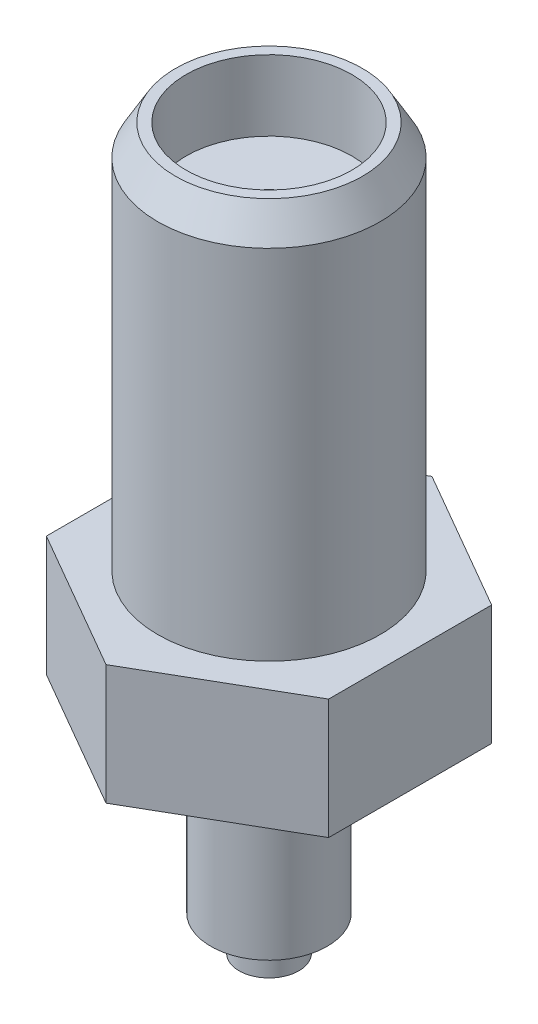
ISO-10303-21;
HEADER;
FILE_DESCRIPTION(('STEP AP214'),'2;1');
FILE_NAME('part.step','',(''),(''),'','','');
FILE_SCHEMA(('AUTOMOTIVE_DESIGN { 1 0 10303 214 1 1 1 1 }'));
ENDSEC;
DATA;
#1=APPLICATION_CONTEXT('core data for automotive mechanical design processes');
#2=APPLICATION_PROTOCOL_DEFINITION('international standard','automotive_design',2000,#1);
#3=PRODUCT_CONTEXT('',#1,'mechanical');
#4=PRODUCT('Part','Part','',(#3));
#5=PRODUCT_RELATED_PRODUCT_CATEGORY('part','',(#4));
#6=PRODUCT_DEFINITION_FORMATION('','',#4);
#7=PRODUCT_DEFINITION_CONTEXT('part definition',#1,'design');
#8=PRODUCT_DEFINITION('design','',#6,#7);
#9=PRODUCT_DEFINITION_SHAPE('','',#8);
#10=(LENGTH_UNIT() NAMED_UNIT(*) SI_UNIT(.MILLI.,.METRE.));
#11=(NAMED_UNIT(*) PLANE_ANGLE_UNIT() SI_UNIT($,.RADIAN.));
#12=(NAMED_UNIT(*) SI_UNIT($,.STERADIAN.) SOLID_ANGLE_UNIT());
#13=UNCERTAINTY_MEASURE_WITH_UNIT(LENGTH_MEASURE(1.E-05),#10,'distance_accuracy_value','');
#14=(GEOMETRIC_REPRESENTATION_CONTEXT(3) GLOBAL_UNCERTAINTY_ASSIGNED_CONTEXT((#13)) GLOBAL_UNIT_ASSIGNED_CONTEXT((#10,
#11,#12)) REPRESENTATION_CONTEXT('',''));
#15=CARTESIAN_POINT('',(0.,0.,0.));
#16=DIRECTION('',(0.,0.,1.));
#17=DIRECTION('',(1.,0.,0.));
#18=AXIS2_PLACEMENT_3D('',#15,#16,#17);
#19=CARTESIAN_POINT('',(5.,0.,0.));
#20=DIRECTION('',(0.,1.,0.));
#21=DIRECTION('',(0.,0.,1.));
#22=AXIS2_PLACEMENT_3D('',#19,#20,#21);
#23=PLANE('',#22);
#24=CARTESIAN_POINT('',(0.,0.,0.));
#25=DIRECTION('',(0.,-1.,0.));
#26=DIRECTION('',(0.,0.,-1.));
#27=AXIS2_PLACEMENT_3D('',#24,#25,#26);
#28=CIRCLE('',#27,3.15000000000001);
#29=CARTESIAN_POINT('',(0.,0.,-3.15000000000001));
#30=VERTEX_POINT('',#29);
#31=EDGE_CURVE('E99',#30,#30,#28,.T.);
#32=ORIENTED_EDGE('',*,*,#31,.T.);
#33=EDGE_LOOP('',(#32));
#34=FACE_BOUND('',#33,.T.);
#35=DIRECTION('',(-0.866025403784439,0.,-0.499999999999999));
#36=VECTOR('',#35,1.);
#37=CARTESIAN_POINT('',(4.,0.,-2.3094010767585));
#38=LINE('',#37,#36);
#39=CARTESIAN_POINT('',(4.,0.,-2.3094010767585));
#40=VERTEX_POINT('',#39);
#41=CARTESIAN_POINT('',(0.,0.,-4.618802153517));
#42=VERTEX_POINT('',#41);
#43=EDGE_CURVE('E128',#40,#42,#38,.T.);
#44=ORIENTED_EDGE('',*,*,#43,.T.);
#45=DIRECTION('',(-0.866025403784439,0.,0.5));
#46=VECTOR('',#45,1.);
#47=CARTESIAN_POINT('',(0.,0.,-4.618802153517));
#48=LINE('',#47,#46);
#49=CARTESIAN_POINT('',(-4.,0.,-2.3094010767585));
#50=VERTEX_POINT('',#49);
#51=EDGE_CURVE('E116',#42,#50,#48,.T.);
#52=ORIENTED_EDGE('',*,*,#51,.T.);
#53=DIRECTION('',(0.,0.,1.));
#54=VECTOR('',#53,1.);
#55=CARTESIAN_POINT('',(-4.,0.,-2.3094010767585));
#56=LINE('',#55,#54);
#57=CARTESIAN_POINT('',(-4.,0.,2.3094010767585));
#58=VERTEX_POINT('',#57);
#59=EDGE_CURVE('E119',#50,#58,#56,.T.);
#60=ORIENTED_EDGE('',*,*,#59,.T.);
#61=DIRECTION('',(0.866025403784439,0.,0.5));
#62=VECTOR('',#61,1.);
#63=CARTESIAN_POINT('',(-4.,0.,2.3094010767585));
#64=LINE('',#63,#62);
#65=CARTESIAN_POINT('',(0.,0.,4.61880215351701));
#66=VERTEX_POINT('',#65);
#67=EDGE_CURVE('E55',#58,#66,#64,.T.);
#68=ORIENTED_EDGE('',*,*,#67,.T.);
#69=DIRECTION('',(0.866025403784439,0.,-0.5));
#70=VECTOR('',#69,1.);
#71=CARTESIAN_POINT('',(0.,0.,4.61880215351701));
#72=LINE('',#71,#70);
#73=CARTESIAN_POINT('',(4.,0.,2.3094010767585));
#74=VERTEX_POINT('',#73);
#75=EDGE_CURVE('E122',#66,#74,#72,.T.);
#76=ORIENTED_EDGE('',*,*,#75,.T.);
#77=DIRECTION('',(0.,0.,-1.));
#78=VECTOR('',#77,1.);
#79=CARTESIAN_POINT('',(4.,0.,2.3094010767585));
#80=LINE('',#79,#78);
#81=EDGE_CURVE('E125',#74,#40,#80,.T.);
#82=ORIENTED_EDGE('',*,*,#81,.T.);
#83=EDGE_LOOP('',(#44,#52,#60,#68,#76,#82));
#84=FACE_BOUND('',#83,.T.);
#85=ADVANCED_FACE('F32',(#34,#84),#23,.T.);
#86=CARTESIAN_POINT('',(2.35,11.,0.));
#87=DIRECTION('',(0.,1.,0.));
#88=DIRECTION('',(0.,0.,1.));
#89=AXIS2_PLACEMENT_3D('',#86,#87,#88);
#90=PLANE('',#89);
#91=CARTESIAN_POINT('',(0.,11.,0.));
#92=DIRECTION('',(0.,1.,0.));
#93=DIRECTION('',(0.,0.,1.));
#94=AXIS2_PLACEMENT_3D('',#91,#92,#93);
#95=CIRCLE('',#94,2.65000000000001);
#96=CARTESIAN_POINT('',(0.,11.,2.65000000000001));
#97=VERTEX_POINT('',#96);
#98=EDGE_CURVE('E11',#97,#97,#95,.T.);
#99=ORIENTED_EDGE('',*,*,#98,.T.);
#100=EDGE_LOOP('',(#99));
#101=FACE_BOUND('',#100,.T.);
#102=CARTESIAN_POINT('',(0.,11.,0.));
#103=DIRECTION('',(0.,-1.,0.));
#104=DIRECTION('',(0.,0.,-1.));
#105=AXIS2_PLACEMENT_3D('',#102,#103,#104);
#106=CIRCLE('',#105,2.35);
#107=CARTESIAN_POINT('',(0.,11.,-2.35));
#108=VERTEX_POINT('',#107);
#109=EDGE_CURVE('E161',#108,#108,#106,.T.);
#110=ORIENTED_EDGE('',*,*,#109,.T.);
#111=EDGE_LOOP('',(#110));
#112=FACE_BOUND('',#111,.T.);
#113=ADVANCED_FACE('F182',(#101,#112),#90,.T.);
#114=CARTESIAN_POINT('',(0.,0.,0.));
#115=DIRECTION('',(0.,-1.,0.));
#116=DIRECTION('',(0.,0.,-1.));
#117=AXIS2_PLACEMENT_3D('',#114,#115,#116);
#118=CYLINDRICAL_SURFACE('',#117,2.35);
#119=CARTESIAN_POINT('',(0.,9.,0.));
#120=DIRECTION('',(0.,-1.,0.));
#121=DIRECTION('',(0.,0.,-1.));
#122=AXIS2_PLACEMENT_3D('',#119,#120,#121);
#123=CIRCLE('',#122,2.35);
#124=CARTESIAN_POINT('',(0.,9.,-2.35));
#125=VERTEX_POINT('',#124);
#126=EDGE_CURVE('E158',#125,#125,#123,.T.);
#127=ORIENTED_EDGE('',*,*,#126,.T.);
#128=EDGE_LOOP('',(#127));
#129=FACE_BOUND('',#128,.T.);
#130=ORIENTED_EDGE('',*,*,#109,.F.);
#131=EDGE_LOOP('',(#130));
#132=FACE_BOUND('',#131,.T.);
#133=ADVANCED_FACE('F188',(#129,#132),#118,.F.);
#134=CARTESIAN_POINT('',(2.35,9.,0.));
#135=DIRECTION('',(0.,1.,0.));
#136=DIRECTION('',(0.,0.,1.));
#137=AXIS2_PLACEMENT_3D('',#134,#135,#136);
#138=PLANE('',#137);
#139=CARTESIAN_POINT('',(0.,9.,0.));
#140=DIRECTION('',(0.,-1.,0.));
#141=DIRECTION('',(0.,0.,-1.));
#142=AXIS2_PLACEMENT_3D('',#139,#140,#141);
#143=CIRCLE('',#142,0.5);
#144=CARTESIAN_POINT('',(0.,9.,-0.5));
#145=VERTEX_POINT('',#144);
#146=EDGE_CURVE('E155',#145,#145,#143,.T.);
#147=ORIENTED_EDGE('',*,*,#146,.T.);
#148=EDGE_LOOP('',(#147));
#149=FACE_BOUND('',#148,.T.);
#150=ORIENTED_EDGE('',*,*,#126,.F.);
#151=EDGE_LOOP('',(#150));
#152=FACE_BOUND('',#151,.T.);
#153=ADVANCED_FACE('F217',(#149,#152),#138,.T.);
#154=CARTESIAN_POINT('',(0.,0.,0.));
#155=DIRECTION('',(0.,-1.,0.));
#156=DIRECTION('',(0.,0.,-1.));
#157=AXIS2_PLACEMENT_3D('',#154,#155,#156);
#158=CYLINDRICAL_SURFACE('',#157,0.5);
#159=CARTESIAN_POINT('',(0.,4.,0.));
#160=DIRECTION('',(0.,-1.,0.));
#161=DIRECTION('',(0.,0.,-1.));
#162=AXIS2_PLACEMENT_3D('',#159,#160,#161);
#163=CIRCLE('',#162,0.500000000000001);
#164=CARTESIAN_POINT('',(0.,4.,-0.500000000000001));
#165=VERTEX_POINT('',#164);
#166=EDGE_CURVE('E152',#165,#165,#163,.T.);
#167=ORIENTED_EDGE('',*,*,#166,.T.);
#168=EDGE_LOOP('',(#167));
#169=FACE_BOUND('',#168,.T.);
#170=ORIENTED_EDGE('',*,*,#146,.F.);
#171=EDGE_LOOP('',(#170));
#172=FACE_BOUND('',#171,.T.);
#173=ADVANCED_FACE('F213',(#169,#172),#158,.F.);
#174=CARTESIAN_POINT('',(0.500000000000001,4.,0.));
#175=DIRECTION('',(0.,1.,0.));
#176=DIRECTION('',(0.,0.,1.));
#177=AXIS2_PLACEMENT_3D('',#174,#175,#176);
#178=PLANE('',#177);
#179=ORIENTED_EDGE('',*,*,#166,.F.);
#180=EDGE_LOOP('',(#179));
#181=FACE_BOUND('',#180,.T.);
#182=ADVANCED_FACE('F178',(#181),#178,.T.);
#183=CARTESIAN_POINT('',(0.,0.,0.));
#184=DIRECTION('',(0.,-1.,0.));
#185=DIRECTION('',(0.,0.,-1.));
#186=AXIS2_PLACEMENT_3D('',#183,#184,#185);
#187=CYLINDRICAL_SURFACE('',#186,3.15);
#188=CARTESIAN_POINT('',(0.,10.1339745962156,0.));
#189=DIRECTION('',(0.,1.,0.));
#190=DIRECTION('',(0.,0.,1.));
#191=AXIS2_PLACEMENT_3D('',#188,#189,#190);
#192=CIRCLE('',#191,3.15);
#193=CARTESIAN_POINT('',(0.,10.1339745962156,3.15));
#194=VERTEX_POINT('',#193);
#195=EDGE_CURVE('E40',#194,#194,#192,.F.);
#196=ORIENTED_EDGE('',*,*,#195,.T.);
#197=EDGE_LOOP('',(#196));
#198=FACE_BOUND('',#197,.T.);
#199=ORIENTED_EDGE('',*,*,#31,.F.);
#200=EDGE_LOOP('',(#199));
#201=FACE_BOUND('',#200,.T.);
#202=ADVANCED_FACE('F166',(#198,#201),#187,.T.);
#203=CARTESIAN_POINT('',(0.,10.1339745962156,0.));
#204=DIRECTION('',(0.,-1.,0.));
#205=DIRECTION('',(0.,0.,-1.));
#206=AXIS2_PLACEMENT_3D('',#203,#204,#205);
#207=CONICAL_SURFACE('',#206,3.15,0.5235987755983);
#208=ORIENTED_EDGE('',*,*,#98,.F.);
#209=EDGE_LOOP('',(#208));
#210=FACE_BOUND('',#209,.T.);
#211=ORIENTED_EDGE('',*,*,#195,.F.);
#212=EDGE_LOOP('',(#211));
#213=FACE_BOUND('',#212,.T.);
#214=ADVANCED_FACE('F34',(#210,#213),#207,.T.);
#215=CARTESIAN_POINT('',(0.,-9.401,-4.618802153517));
#216=DIRECTION('',(-0.5,0.,-0.866025403784439));
#217=DIRECTION('',(-0.866025403784439,0.,0.5));
#218=AXIS2_PLACEMENT_3D('',#215,#216,#217);
#219=PLANE('',#218);
#220=DIRECTION('',(-0.866025403784439,0.,0.5));
#221=VECTOR('',#220,1.);
#222=CARTESIAN_POINT('',(0.,-3.4,-4.618802153517));
#223=LINE('',#222,#221);
#224=CARTESIAN_POINT('',(0.,-3.4,-4.618802153517));
#225=VERTEX_POINT('',#224);
#226=CARTESIAN_POINT('',(-4.,-3.4,-2.3094010767585));
#227=VERTEX_POINT('',#226);
#228=EDGE_CURVE('E47',#225,#227,#223,.T.);
#229=ORIENTED_EDGE('',*,*,#228,.T.);
#230=DIRECTION('',(0.,1.,0.));
#231=VECTOR('',#230,1.);
#232=CARTESIAN_POINT('',(-4.,-9.401,-2.3094010767585));
#233=LINE('',#232,#231);
#234=EDGE_CURVE('E93',#227,#50,#233,.T.);
#235=ORIENTED_EDGE('',*,*,#234,.T.);
#236=ORIENTED_EDGE('',*,*,#51,.F.);
#237=DIRECTION('',(0.,1.,0.));
#238=VECTOR('',#237,1.);
#239=CARTESIAN_POINT('',(0.,-9.401,-4.618802153517));
#240=LINE('',#239,#238);
#241=EDGE_CURVE('E100',#225,#42,#240,.T.);
#242=ORIENTED_EDGE('',*,*,#241,.F.);
#243=EDGE_LOOP('',(#229,#235,#236,#242));
#244=FACE_BOUND('',#243,.T.);
#245=ADVANCED_FACE('F170',(#244),#219,.T.);
#246=CARTESIAN_POINT('',(4.,-9.401,-2.3094010767585));
#247=DIRECTION('',(0.499999999999999,0.,-0.866025403784439));
#248=DIRECTION('',(-0.866025403784439,0.,-0.5));
#249=AXIS2_PLACEMENT_3D('',#246,#247,#248);
#250=PLANE('',#249);
#251=DIRECTION('',(-0.866025403784439,0.,-0.5));
#252=VECTOR('',#251,1.);
#253=CARTESIAN_POINT('',(4.,-3.4,-2.3094010767585));
#254=LINE('',#253,#252);
#255=CARTESIAN_POINT('',(4.,-3.4,-2.3094010767585));
#256=VERTEX_POINT('',#255);
#257=EDGE_CURVE('E112',#256,#225,#254,.T.);
#258=ORIENTED_EDGE('',*,*,#257,.T.);
#259=ORIENTED_EDGE('',*,*,#241,.T.);
#260=ORIENTED_EDGE('',*,*,#43,.F.);
#261=DIRECTION('',(0.,1.,0.));
#262=VECTOR('',#261,1.);
#263=CARTESIAN_POINT('',(4.,-9.401,-2.3094010767585));
#264=LINE('',#263,#262);
#265=EDGE_CURVE('E132',#256,#40,#264,.T.);
#266=ORIENTED_EDGE('',*,*,#265,.F.);
#267=EDGE_LOOP('',(#258,#259,#260,#266));
#268=FACE_BOUND('',#267,.T.);
#269=ADVANCED_FACE('F176',(#268),#250,.T.);
#270=CARTESIAN_POINT('',(4.,-9.401,2.3094010767585));
#271=DIRECTION('',(1.,0.,0.));
#272=DIRECTION('',(0.,0.,-1.));
#273=AXIS2_PLACEMENT_3D('',#270,#271,#272);
#274=PLANE('',#273);
#275=DIRECTION('',(0.,0.,-1.));
#276=VECTOR('',#275,1.);
#277=CARTESIAN_POINT('',(4.,-3.4,2.3094010767585));
#278=LINE('',#277,#276);
#279=CARTESIAN_POINT('',(4.,-3.4,2.3094010767585));
#280=VERTEX_POINT('',#279);
#281=EDGE_CURVE('E107',#280,#256,#278,.T.);
#282=ORIENTED_EDGE('',*,*,#281,.T.);
#283=ORIENTED_EDGE('',*,*,#265,.T.);
#284=ORIENTED_EDGE('',*,*,#81,.F.);
#285=DIRECTION('',(0.,1.,0.));
#286=VECTOR('',#285,1.);
#287=CARTESIAN_POINT('',(4.,-9.401,2.3094010767585));
#288=LINE('',#287,#286);
#289=EDGE_CURVE('E134',#280,#74,#288,.T.);
#290=ORIENTED_EDGE('',*,*,#289,.F.);
#291=EDGE_LOOP('',(#282,#283,#284,#290));
#292=FACE_BOUND('',#291,.T.);
#293=ADVANCED_FACE('F278',(#292),#274,.T.);
#294=CARTESIAN_POINT('',(0.,-9.401,4.61880215351701));
#295=DIRECTION('',(0.5,0.,0.866025403784438));
#296=DIRECTION('',(0.866025403784439,0.,-0.5));
#297=AXIS2_PLACEMENT_3D('',#294,#295,#296);
#298=PLANE('',#297);
#299=DIRECTION('',(0.866025403784439,0.,-0.5));
#300=VECTOR('',#299,1.);
#301=CARTESIAN_POINT('',(0.,-3.4,4.61880215351701));
#302=LINE('',#301,#300);
#303=CARTESIAN_POINT('',(0.,-3.4,4.61880215351701));
#304=VERTEX_POINT('',#303);
#305=EDGE_CURVE('E105',#304,#280,#302,.T.);
#306=ORIENTED_EDGE('',*,*,#305,.T.);
#307=ORIENTED_EDGE('',*,*,#289,.T.);
#308=ORIENTED_EDGE('',*,*,#75,.F.);
#309=DIRECTION('',(0.,1.,0.));
#310=VECTOR('',#309,1.);
#311=CARTESIAN_POINT('',(0.,-9.401,4.61880215351701));
#312=LINE('',#311,#310);
#313=EDGE_CURVE('E92',#304,#66,#312,.T.);
#314=ORIENTED_EDGE('',*,*,#313,.F.);
#315=EDGE_LOOP('',(#306,#307,#308,#314));
#316=FACE_BOUND('',#315,.T.);
#317=ADVANCED_FACE('F288',(#316),#298,.T.);
#318=CARTESIAN_POINT('',(-4.,-9.401,2.3094010767585));
#319=DIRECTION('',(-0.5,0.,0.866025403784439));
#320=DIRECTION('',(0.866025403784439,0.,0.5));
#321=AXIS2_PLACEMENT_3D('',#318,#319,#320);
#322=PLANE('',#321);
#323=DIRECTION('',(0.866025403784439,0.,0.5));
#324=VECTOR('',#323,1.);
#325=CARTESIAN_POINT('',(-4.,-3.4,2.3094010767585));
#326=LINE('',#325,#324);
#327=CARTESIAN_POINT('',(-4.,-3.4,2.30940107675851));
#328=VERTEX_POINT('',#327);
#329=EDGE_CURVE('E87',#328,#304,#326,.T.);
#330=ORIENTED_EDGE('',*,*,#329,.T.);
#331=ORIENTED_EDGE('',*,*,#313,.T.);
#332=ORIENTED_EDGE('',*,*,#67,.F.);
#333=DIRECTION('',(0.,1.,0.));
#334=VECTOR('',#333,1.);
#335=CARTESIAN_POINT('',(-4.,-9.401,2.3094010767585));
#336=LINE('',#335,#334);
#337=EDGE_CURVE('E83',#328,#58,#336,.T.);
#338=ORIENTED_EDGE('',*,*,#337,.F.);
#339=EDGE_LOOP('',(#330,#331,#332,#338));
#340=FACE_BOUND('',#339,.T.);
#341=ADVANCED_FACE('F85',(#340),#322,.T.);
#342=CARTESIAN_POINT('',(-4.,-9.401,-2.3094010767585));
#343=DIRECTION('',(-1.,0.,0.));
#344=DIRECTION('',(0.,0.,1.));
#345=AXIS2_PLACEMENT_3D('',#342,#343,#344);
#346=PLANE('',#345);
#347=DIRECTION('',(0.,0.,1.));
#348=VECTOR('',#347,1.);
#349=CARTESIAN_POINT('',(-4.,-3.4,-2.3094010767585));
#350=LINE('',#349,#348);
#351=EDGE_CURVE('E96',#227,#328,#350,.T.);
#352=ORIENTED_EDGE('',*,*,#351,.T.);
#353=ORIENTED_EDGE('',*,*,#337,.T.);
#354=ORIENTED_EDGE('',*,*,#59,.F.);
#355=ORIENTED_EDGE('',*,*,#234,.F.);
#356=EDGE_LOOP('',(#352,#353,#354,#355));
#357=FACE_BOUND('',#356,.T.);
#358=ADVANCED_FACE('F97',(#357),#346,.T.);
#359=CARTESIAN_POINT('',(0.,-9.4,0.));
#360=DIRECTION('',(0.,-1.,0.));
#361=DIRECTION('',(0.,0.,-1.));
#362=AXIS2_PLACEMENT_3D('',#359,#360,#361);
#363=PLANE('',#362);
#364=CARTESIAN_POINT('',(0.,-9.4,0.));
#365=DIRECTION('',(0.,-1.,0.));
#366=DIRECTION('',(0.,0.,-1.));
#367=AXIS2_PLACEMENT_3D('',#364,#365,#366);
#368=CIRCLE('',#367,0.85);
#369=CARTESIAN_POINT('',(0.,-9.4,-0.85));
#370=VERTEX_POINT('',#369);
#371=EDGE_CURVE('E149',#370,#370,#368,.T.);
#372=ORIENTED_EDGE('',*,*,#371,.T.);
#373=EDGE_LOOP('',(#372));
#374=FACE_BOUND('',#373,.T.);
#375=ADVANCED_FACE('F206',(#374),#363,.T.);
#376=CARTESIAN_POINT('',(0.,0.,0.));
#377=DIRECTION('',(0.,-1.,0.));
#378=DIRECTION('',(0.,0.,-1.));
#379=AXIS2_PLACEMENT_3D('',#376,#377,#378);
#380=CYLINDRICAL_SURFACE('',#379,0.85);
#381=CARTESIAN_POINT('',(0.,-8.4,0.));
#382=DIRECTION('',(0.,-1.,0.));
#383=DIRECTION('',(0.,0.,-1.));
#384=AXIS2_PLACEMENT_3D('',#381,#382,#383);
#385=CIRCLE('',#384,0.85);
#386=CARTESIAN_POINT('',(0.,-8.4,-0.85));
#387=VERTEX_POINT('',#386);
#388=EDGE_CURVE('E146',#387,#387,#385,.T.);
#389=ORIENTED_EDGE('',*,*,#388,.T.);
#390=EDGE_LOOP('',(#389));
#391=FACE_BOUND('',#390,.T.);
#392=ORIENTED_EDGE('',*,*,#371,.F.);
#393=EDGE_LOOP('',(#392));
#394=FACE_BOUND('',#393,.T.);
#395=ADVANCED_FACE('F202',(#391,#394),#380,.T.);
#396=CARTESIAN_POINT('',(0.85,-8.4,0.));
#397=DIRECTION('',(0.,-1.,0.));
#398=DIRECTION('',(0.,0.,-1.));
#399=AXIS2_PLACEMENT_3D('',#396,#397,#398);
#400=PLANE('',#399);
#401=CARTESIAN_POINT('',(0.,-8.4,0.));
#402=DIRECTION('',(0.,-1.,0.));
#403=DIRECTION('',(0.,0.,-1.));
#404=AXIS2_PLACEMENT_3D('',#401,#402,#403);
#405=CIRCLE('',#404,1.65);
#406=CARTESIAN_POINT('',(0.,-8.4,-1.65));
#407=VERTEX_POINT('',#406);
#408=EDGE_CURVE('E143',#407,#407,#405,.T.);
#409=ORIENTED_EDGE('',*,*,#408,.T.);
#410=EDGE_LOOP('',(#409));
#411=FACE_BOUND('',#410,.T.);
#412=ORIENTED_EDGE('',*,*,#388,.F.);
#413=EDGE_LOOP('',(#412));
#414=FACE_BOUND('',#413,.T.);
#415=ADVANCED_FACE('F198',(#411,#414),#400,.T.);
#416=CARTESIAN_POINT('',(0.,0.,0.));
#417=DIRECTION('',(0.,-1.,0.));
#418=DIRECTION('',(0.,0.,-1.));
#419=AXIS2_PLACEMENT_3D('',#416,#417,#418);
#420=CYLINDRICAL_SURFACE('',#419,1.65);
#421=CARTESIAN_POINT('',(0.,-3.4,0.));
#422=DIRECTION('',(0.,-1.,0.));
#423=DIRECTION('',(0.,0.,-1.));
#424=AXIS2_PLACEMENT_3D('',#421,#422,#423);
#425=CIRCLE('',#424,1.65);
#426=CARTESIAN_POINT('',(0.,-3.4,-1.65));
#427=VERTEX_POINT('',#426);
#428=EDGE_CURVE('E140',#427,#427,#425,.T.);
#429=ORIENTED_EDGE('',*,*,#428,.T.);
#430=EDGE_LOOP('',(#429));
#431=FACE_BOUND('',#430,.T.);
#432=ORIENTED_EDGE('',*,*,#408,.F.);
#433=EDGE_LOOP('',(#432));
#434=FACE_BOUND('',#433,.T.);
#435=ADVANCED_FACE('F194',(#431,#434),#420,.T.);
#436=CARTESIAN_POINT('',(1.65,-3.4,0.));
#437=DIRECTION('',(0.,-1.,0.));
#438=DIRECTION('',(0.,0.,-1.));
#439=AXIS2_PLACEMENT_3D('',#436,#437,#438);
#440=PLANE('',#439);
#441=ORIENTED_EDGE('',*,*,#428,.F.);
#442=EDGE_LOOP('',(#441));
#443=FACE_BOUND('',#442,.T.);
#444=ORIENTED_EDGE('',*,*,#351,.F.);
#445=ORIENTED_EDGE('',*,*,#228,.F.);
#446=ORIENTED_EDGE('',*,*,#257,.F.);
#447=ORIENTED_EDGE('',*,*,#281,.F.);
#448=ORIENTED_EDGE('',*,*,#305,.F.);
#449=ORIENTED_EDGE('',*,*,#329,.F.);
#450=EDGE_LOOP('',(#444,#445,#446,#447,#448,#449));
#451=FACE_BOUND('',#450,.T.);
#452=ADVANCED_FACE('F102',(#443,#451),#440,.T.);
#453=CLOSED_SHELL('',(#85,#113,#133,#153,#173,#182,#202,#214,#245,#269,#293,#317,#341,#358,#375,
#395,#415,#435,#452));
#454=MANIFOLD_SOLID_BREP('B2',#453);
#455=ADVANCED_BREP_SHAPE_REPRESENTATION('',(#18,#454),#14);
#456=SHAPE_DEFINITION_REPRESENTATION(#9,#455);
ENDSEC;
END-ISO-10303-21;
